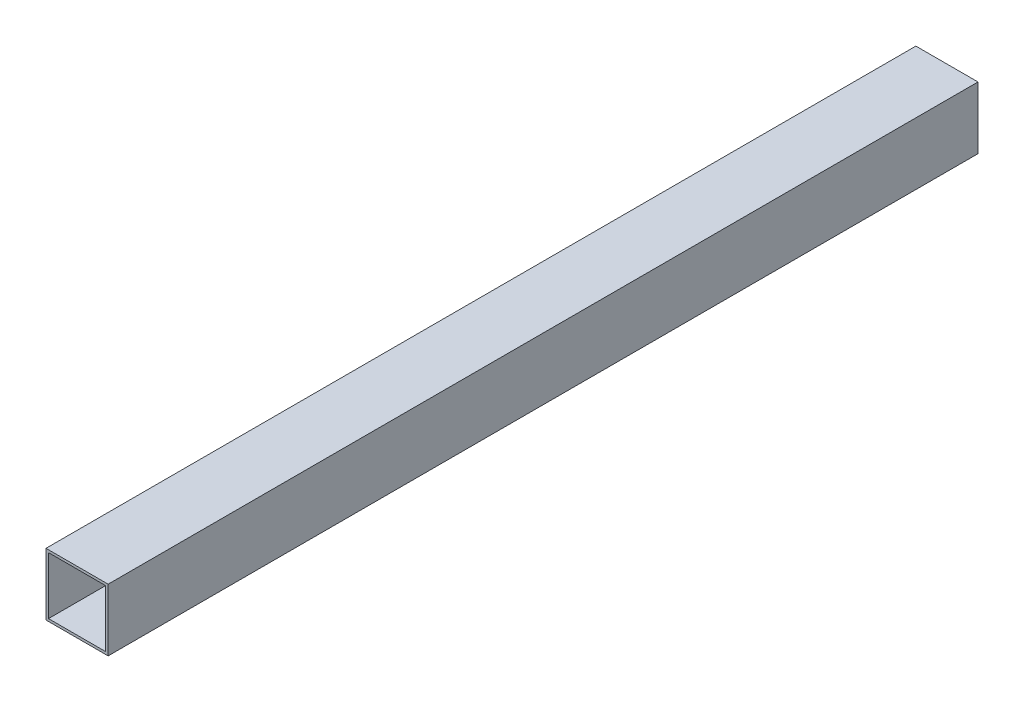
ISO-10303-21;
HEADER;
FILE_DESCRIPTION(('STEP AP214'),'2;1');
FILE_NAME('part.step','',(''),(''),'','','');
FILE_SCHEMA(('AUTOMOTIVE_DESIGN { 1 0 10303 214 1 1 1 1 }'));
ENDSEC;
DATA;
#1=APPLICATION_CONTEXT('core data for automotive mechanical design processes');
#2=APPLICATION_PROTOCOL_DEFINITION('international standard','automotive_design',2000,#1);
#3=PRODUCT_CONTEXT('',#1,'mechanical');
#4=PRODUCT('Part','Part','',(#3));
#5=PRODUCT_RELATED_PRODUCT_CATEGORY('part','',(#4));
#6=PRODUCT_DEFINITION_FORMATION('','',#4);
#7=PRODUCT_DEFINITION_CONTEXT('part definition',#1,'design');
#8=PRODUCT_DEFINITION('design','',#6,#7);
#9=PRODUCT_DEFINITION_SHAPE('','',#8);
#10=(LENGTH_UNIT() NAMED_UNIT(*) SI_UNIT(.MILLI.,.METRE.));
#11=(NAMED_UNIT(*) PLANE_ANGLE_UNIT() SI_UNIT($,.RADIAN.));
#12=(NAMED_UNIT(*) SI_UNIT($,.STERADIAN.) SOLID_ANGLE_UNIT());
#13=UNCERTAINTY_MEASURE_WITH_UNIT(LENGTH_MEASURE(1.E-05),#10,'distance_accuracy_value','');
#14=(GEOMETRIC_REPRESENTATION_CONTEXT(3) GLOBAL_UNCERTAINTY_ASSIGNED_CONTEXT((#13)) GLOBAL_UNIT_ASSIGNED_CONTEXT((#10,
#11,#12)) REPRESENTATION_CONTEXT('',''));
#15=CARTESIAN_POINT('',(0.,0.,0.));
#16=DIRECTION('',(0.,0.,1.));
#17=DIRECTION('',(1.,0.,0.));
#18=AXIS2_PLACEMENT_3D('',#15,#16,#17);
#19=CARTESIAN_POINT('',(348.,-23.,50.));
#20=DIRECTION('',(1.,0.,0.));
#21=DIRECTION('',(0.,1.,0.));
#22=AXIS2_PLACEMENT_3D('',#19,#20,#21);
#23=PLANE('',#22);
#24=DIRECTION('',(0.,1.,0.));
#25=VECTOR('',#24,1.);
#26=CARTESIAN_POINT('',(348.,0.,750.));
#27=LINE('',#26,#25);
#28=CARTESIAN_POINT('',(348.,-23.,750.));
#29=VERTEX_POINT('',#28);
#30=CARTESIAN_POINT('',(348.,23.,750.));
#31=VERTEX_POINT('',#30);
#32=EDGE_CURVE('E130',#29,#31,#27,.T.);
#33=ORIENTED_EDGE('',*,*,#32,.T.);
#34=DIRECTION('',(0.,0.,-1.));
#35=VECTOR('',#34,1.);
#36=CARTESIAN_POINT('',(348.,23.,400.));
#37=LINE('',#36,#35);
#38=CARTESIAN_POINT('',(348.,23.,50.));
#39=VERTEX_POINT('',#38);
#40=EDGE_CURVE('E19',#31,#39,#37,.T.);
#41=ORIENTED_EDGE('',*,*,#40,.T.);
#42=DIRECTION('',(0.,-1.,0.));
#43=VECTOR('',#42,1.);
#44=CARTESIAN_POINT('',(348.,0.,50.));
#45=LINE('',#44,#43);
#46=CARTESIAN_POINT('',(348.,-23.,50.));
#47=VERTEX_POINT('',#46);
#48=EDGE_CURVE('E80',#39,#47,#45,.T.);
#49=ORIENTED_EDGE('',*,*,#48,.T.);
#50=DIRECTION('',(0.,0.,1.));
#51=VECTOR('',#50,1.);
#52=CARTESIAN_POINT('',(348.,-23.,400.));
#53=LINE('',#52,#51);
#54=EDGE_CURVE('E82',#47,#29,#53,.T.);
#55=ORIENTED_EDGE('',*,*,#54,.T.);
#56=EDGE_LOOP('',(#33,#41,#49,#55));
#57=FACE_BOUND('',#56,.T.);
#58=ADVANCED_FACE('F15',(#57),#23,.F.);
#59=CARTESIAN_POINT('',(302.,23.,50.));
#60=DIRECTION('',(0.,1.,0.));
#61=DIRECTION('',(0.,0.,1.));
#62=AXIS2_PLACEMENT_3D('',#59,#60,#61);
#63=PLANE('',#62);
#64=DIRECTION('',(-1.,0.,0.));
#65=VECTOR('',#64,1.);
#66=CARTESIAN_POINT('',(325.,23.,750.));
#67=LINE('',#66,#65);
#68=CARTESIAN_POINT('',(302.,23.,750.));
#69=VERTEX_POINT('',#68);
#70=EDGE_CURVE('E115',#31,#69,#67,.T.);
#71=ORIENTED_EDGE('',*,*,#70,.T.);
#72=DIRECTION('',(0.,0.,-1.));
#73=VECTOR('',#72,1.);
#74=CARTESIAN_POINT('',(302.,23.,400.));
#75=LINE('',#74,#73);
#76=CARTESIAN_POINT('',(302.,23.,50.));
#77=VERTEX_POINT('',#76);
#78=EDGE_CURVE('E99',#69,#77,#75,.T.);
#79=ORIENTED_EDGE('',*,*,#78,.T.);
#80=DIRECTION('',(1.,0.,0.));
#81=VECTOR('',#80,1.);
#82=CARTESIAN_POINT('',(325.,23.,50.));
#83=LINE('',#82,#81);
#84=EDGE_CURVE('E106',#77,#39,#83,.T.);
#85=ORIENTED_EDGE('',*,*,#84,.T.);
#86=ORIENTED_EDGE('',*,*,#40,.F.);
#87=EDGE_LOOP('',(#71,#79,#85,#86));
#88=FACE_BOUND('',#87,.T.);
#89=ADVANCED_FACE('F113',(#88),#63,.F.);
#90=CARTESIAN_POINT('',(302.,23.,50.));
#91=DIRECTION('',(-1.,0.,0.));
#92=DIRECTION('',(0.,-1.,0.));
#93=AXIS2_PLACEMENT_3D('',#90,#91,#92);
#94=PLANE('',#93);
#95=DIRECTION('',(0.,-1.,0.));
#96=VECTOR('',#95,1.);
#97=CARTESIAN_POINT('',(302.,0.,750.));
#98=LINE('',#97,#96);
#99=CARTESIAN_POINT('',(302.,-23.,750.));
#100=VERTEX_POINT('',#99);
#101=EDGE_CURVE('E133',#69,#100,#98,.T.);
#102=ORIENTED_EDGE('',*,*,#101,.T.);
#103=DIRECTION('',(0.,0.,-1.));
#104=VECTOR('',#103,1.);
#105=CARTESIAN_POINT('',(302.,-23.,400.));
#106=LINE('',#105,#104);
#107=CARTESIAN_POINT('',(302.,-23.,50.));
#108=VERTEX_POINT('',#107);
#109=EDGE_CURVE('E98',#100,#108,#106,.T.);
#110=ORIENTED_EDGE('',*,*,#109,.T.);
#111=DIRECTION('',(0.,1.,0.));
#112=VECTOR('',#111,1.);
#113=CARTESIAN_POINT('',(302.,0.,50.));
#114=LINE('',#113,#112);
#115=EDGE_CURVE('E104',#108,#77,#114,.T.);
#116=ORIENTED_EDGE('',*,*,#115,.T.);
#117=ORIENTED_EDGE('',*,*,#78,.F.);
#118=EDGE_LOOP('',(#102,#110,#116,#117));
#119=FACE_BOUND('',#118,.T.);
#120=ADVANCED_FACE('F118',(#119),#94,.F.);
#121=CARTESIAN_POINT('',(302.,-23.,750.));
#122=DIRECTION('',(0.,-1.,0.));
#123=DIRECTION('',(0.,0.,-1.));
#124=AXIS2_PLACEMENT_3D('',#121,#122,#123);
#125=PLANE('',#124);
#126=DIRECTION('',(1.,0.,0.));
#127=VECTOR('',#126,1.);
#128=CARTESIAN_POINT('',(325.,-23.,750.));
#129=LINE('',#128,#127);
#130=EDGE_CURVE('E96',#100,#29,#129,.T.);
#131=ORIENTED_EDGE('',*,*,#130,.T.);
#132=ORIENTED_EDGE('',*,*,#54,.F.);
#133=DIRECTION('',(-1.,0.,0.));
#134=VECTOR('',#133,1.);
#135=CARTESIAN_POINT('',(325.,-23.,50.));
#136=LINE('',#135,#134);
#137=EDGE_CURVE('E87',#47,#108,#136,.T.);
#138=ORIENTED_EDGE('',*,*,#137,.T.);
#139=ORIENTED_EDGE('',*,*,#109,.F.);
#140=EDGE_LOOP('',(#131,#132,#138,#139));
#141=FACE_BOUND('',#140,.T.);
#142=ADVANCED_FACE('F92',(#141),#125,.F.);
#143=CARTESIAN_POINT('',(300.,25.,50.));
#144=DIRECTION('',(0.,1.,0.));
#145=DIRECTION('',(0.,0.,1.));
#146=AXIS2_PLACEMENT_3D('',#143,#144,#145);
#147=PLANE('',#146);
#148=DIRECTION('',(1.,0.,0.));
#149=VECTOR('',#148,1.);
#150=CARTESIAN_POINT('',(325.,25.,750.));
#151=LINE('',#150,#149);
#152=CARTESIAN_POINT('',(300.,25.,750.));
#153=VERTEX_POINT('',#152);
#154=CARTESIAN_POINT('',(350.,25.,750.));
#155=VERTEX_POINT('',#154);
#156=EDGE_CURVE('E126',#153,#155,#151,.T.);
#157=ORIENTED_EDGE('',*,*,#156,.T.);
#158=DIRECTION('',(0.,0.,1.));
#159=VECTOR('',#158,1.);
#160=CARTESIAN_POINT('',(350.,25.,400.));
#161=LINE('',#160,#159);
#162=CARTESIAN_POINT('',(350.,25.,50.));
#163=VERTEX_POINT('',#162);
#164=EDGE_CURVE('E121',#163,#155,#161,.T.);
#165=ORIENTED_EDGE('',*,*,#164,.F.);
#166=DIRECTION('',(-1.,0.,0.));
#167=VECTOR('',#166,1.);
#168=CARTESIAN_POINT('',(325.,25.,50.));
#169=LINE('',#168,#167);
#170=CARTESIAN_POINT('',(300.,25.,50.));
#171=VERTEX_POINT('',#170);
#172=EDGE_CURVE('E88',#163,#171,#169,.T.);
#173=ORIENTED_EDGE('',*,*,#172,.T.);
#174=DIRECTION('',(0.,0.,-1.));
#175=VECTOR('',#174,1.);
#176=CARTESIAN_POINT('',(300.,25.,400.));
#177=LINE('',#176,#175);
#178=EDGE_CURVE('E140',#153,#171,#177,.T.);
#179=ORIENTED_EDGE('',*,*,#178,.F.);
#180=EDGE_LOOP('',(#157,#165,#173,#179));
#181=FACE_BOUND('',#180,.T.);
#182=ADVANCED_FACE('F159',(#181),#147,.T.);
#183=CARTESIAN_POINT('',(300.,-25.,50.));
#184=DIRECTION('',(0.,0.,1.));
#185=DIRECTION('',(1.,0.,0.));
#186=AXIS2_PLACEMENT_3D('',#183,#184,#185);
#187=PLANE('',#186);
#188=ORIENTED_EDGE('',*,*,#115,.F.);
#189=ORIENTED_EDGE('',*,*,#137,.F.);
#190=ORIENTED_EDGE('',*,*,#48,.F.);
#191=ORIENTED_EDGE('',*,*,#84,.F.);
#192=EDGE_LOOP('',(#188,#189,#190,#191));
#193=FACE_BOUND('',#192,.T.);
#194=DIRECTION('',(0.,1.,0.));
#195=VECTOR('',#194,1.);
#196=CARTESIAN_POINT('',(350.,0.,50.));
#197=LINE('',#196,#195);
#198=CARTESIAN_POINT('',(350.,-25.,50.));
#199=VERTEX_POINT('',#198);
#200=EDGE_CURVE('E119',#199,#163,#197,.T.);
#201=ORIENTED_EDGE('',*,*,#200,.F.);
#202=DIRECTION('',(1.,0.,0.));
#203=VECTOR('',#202,1.);
#204=CARTESIAN_POINT('',(325.,-25.,50.));
#205=LINE('',#204,#203);
#206=CARTESIAN_POINT('',(300.,-25.,50.));
#207=VERTEX_POINT('',#206);
#208=EDGE_CURVE('E143',#207,#199,#205,.T.);
#209=ORIENTED_EDGE('',*,*,#208,.F.);
#210=DIRECTION('',(0.,-1.,0.));
#211=VECTOR('',#210,1.);
#212=CARTESIAN_POINT('',(300.,0.,50.));
#213=LINE('',#212,#211);
#214=EDGE_CURVE('E136',#171,#207,#213,.T.);
#215=ORIENTED_EDGE('',*,*,#214,.F.);
#216=ORIENTED_EDGE('',*,*,#172,.F.);
#217=EDGE_LOOP('',(#201,#209,#215,#216));
#218=FACE_BOUND('',#217,.T.);
#219=ADVANCED_FACE('F101',(#193,#218),#187,.F.);
#220=CARTESIAN_POINT('',(350.,-25.,750.));
#221=DIRECTION('',(1.,0.,0.));
#222=DIRECTION('',(0.,0.,-1.));
#223=AXIS2_PLACEMENT_3D('',#220,#221,#222);
#224=PLANE('',#223);
#225=DIRECTION('',(0.,-1.,0.));
#226=VECTOR('',#225,1.);
#227=CARTESIAN_POINT('',(350.,0.,750.));
#228=LINE('',#227,#226);
#229=CARTESIAN_POINT('',(350.,-25.,750.));
#230=VERTEX_POINT('',#229);
#231=EDGE_CURVE('E128',#155,#230,#228,.T.);
#232=ORIENTED_EDGE('',*,*,#231,.T.);
#233=DIRECTION('',(0.,0.,1.));
#234=VECTOR('',#233,1.);
#235=CARTESIAN_POINT('',(350.,-25.,400.));
#236=LINE('',#235,#234);
#237=EDGE_CURVE('E146',#199,#230,#236,.T.);
#238=ORIENTED_EDGE('',*,*,#237,.F.);
#239=ORIENTED_EDGE('',*,*,#200,.T.);
#240=ORIENTED_EDGE('',*,*,#164,.T.);
#241=EDGE_LOOP('',(#232,#238,#239,#240));
#242=FACE_BOUND('',#241,.T.);
#243=ADVANCED_FACE('F156',(#242),#224,.T.);
#244=CARTESIAN_POINT('',(350.,-25.,750.));
#245=DIRECTION('',(0.,0.,-1.));
#246=DIRECTION('',(-1.,0.,0.));
#247=AXIS2_PLACEMENT_3D('',#244,#245,#246);
#248=PLANE('',#247);
#249=ORIENTED_EDGE('',*,*,#101,.F.);
#250=ORIENTED_EDGE('',*,*,#70,.F.);
#251=ORIENTED_EDGE('',*,*,#32,.F.);
#252=ORIENTED_EDGE('',*,*,#130,.F.);
#253=EDGE_LOOP('',(#249,#250,#251,#252));
#254=FACE_BOUND('',#253,.T.);
#255=ORIENTED_EDGE('',*,*,#231,.F.);
#256=ORIENTED_EDGE('',*,*,#156,.F.);
#257=DIRECTION('',(0.,1.,0.));
#258=VECTOR('',#257,1.);
#259=CARTESIAN_POINT('',(300.,0.,750.));
#260=LINE('',#259,#258);
#261=CARTESIAN_POINT('',(300.,-25.,750.));
#262=VERTEX_POINT('',#261);
#263=EDGE_CURVE('E34',#262,#153,#260,.T.);
#264=ORIENTED_EDGE('',*,*,#263,.F.);
#265=DIRECTION('',(-1.,0.,0.));
#266=VECTOR('',#265,1.);
#267=CARTESIAN_POINT('',(325.,-25.,750.));
#268=LINE('',#267,#266);
#269=EDGE_CURVE('E25',#230,#262,#268,.T.);
#270=ORIENTED_EDGE('',*,*,#269,.F.);
#271=EDGE_LOOP('',(#255,#256,#264,#270));
#272=FACE_BOUND('',#271,.T.);
#273=ADVANCED_FACE('F153',(#254,#272),#248,.F.);
#274=CARTESIAN_POINT('',(300.,25.,50.));
#275=DIRECTION('',(-1.,0.,0.));
#276=DIRECTION('',(0.,-1.,0.));
#277=AXIS2_PLACEMENT_3D('',#274,#275,#276);
#278=PLANE('',#277);
#279=ORIENTED_EDGE('',*,*,#263,.T.);
#280=ORIENTED_EDGE('',*,*,#178,.T.);
#281=ORIENTED_EDGE('',*,*,#214,.T.);
#282=DIRECTION('',(0.,0.,-1.));
#283=VECTOR('',#282,1.);
#284=CARTESIAN_POINT('',(300.,-25.,400.));
#285=LINE('',#284,#283);
#286=EDGE_CURVE('E10',#262,#207,#285,.T.);
#287=ORIENTED_EDGE('',*,*,#286,.F.);
#288=EDGE_LOOP('',(#279,#280,#281,#287));
#289=FACE_BOUND('',#288,.T.);
#290=ADVANCED_FACE('F162',(#289),#278,.T.);
#291=CARTESIAN_POINT('',(300.,-25.,750.));
#292=DIRECTION('',(0.,-1.,0.));
#293=DIRECTION('',(0.,0.,-1.));
#294=AXIS2_PLACEMENT_3D('',#291,#292,#293);
#295=PLANE('',#294);
#296=ORIENTED_EDGE('',*,*,#269,.T.);
#297=ORIENTED_EDGE('',*,*,#286,.T.);
#298=ORIENTED_EDGE('',*,*,#208,.T.);
#299=ORIENTED_EDGE('',*,*,#237,.T.);
#300=EDGE_LOOP('',(#296,#297,#298,#299));
#301=FACE_BOUND('',#300,.T.);
#302=ADVANCED_FACE('F17',(#301),#295,.T.);
#303=CLOSED_SHELL('',(#58,#89,#120,#142,#182,#219,#243,#273,#290,#302));
#304=MANIFOLD_SOLID_BREP('B1',#303);
#305=ADVANCED_BREP_SHAPE_REPRESENTATION('',(#18,#304),#14);
#306=SHAPE_DEFINITION_REPRESENTATION(#9,#305);
ENDSEC;
END-ISO-10303-21;
